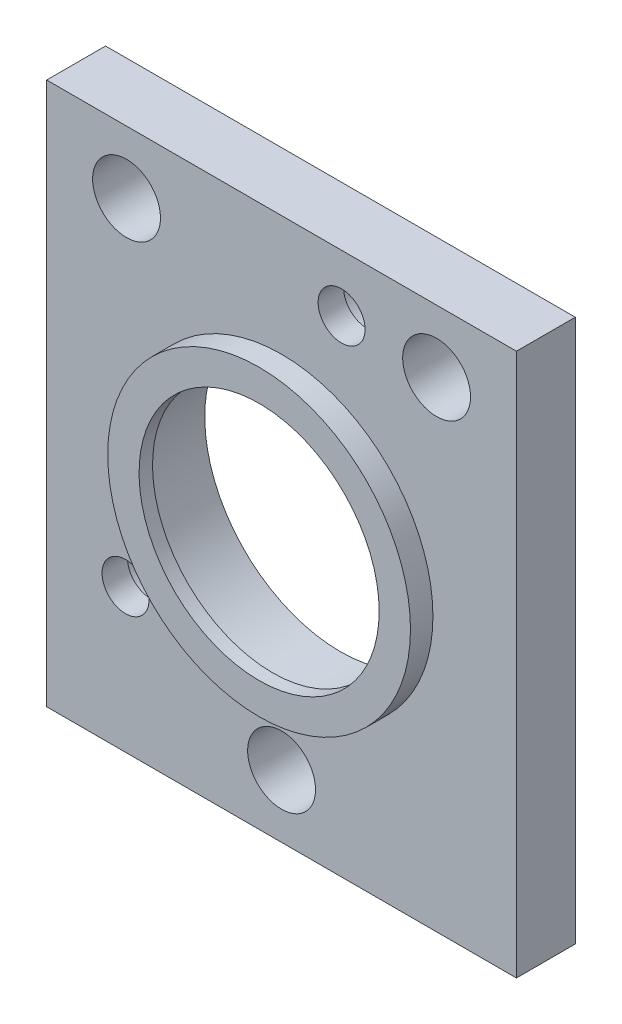
ISO-10303-21;
HEADER;
FILE_DESCRIPTION(('STEP AP214'),'2;1');
FILE_NAME('part.step','',(''),(''),'','','');
FILE_SCHEMA(('AUTOMOTIVE_DESIGN { 1 0 10303 214 1 1 1 1 }'));
ENDSEC;
DATA;
#1=APPLICATION_CONTEXT('core data for automotive mechanical design processes');
#2=APPLICATION_PROTOCOL_DEFINITION('international standard','automotive_design',2000,#1);
#3=PRODUCT_CONTEXT('',#1,'mechanical');
#4=PRODUCT('Part','Part','',(#3));
#5=PRODUCT_RELATED_PRODUCT_CATEGORY('part','',(#4));
#6=PRODUCT_DEFINITION_FORMATION('','',#4);
#7=PRODUCT_DEFINITION_CONTEXT('part definition',#1,'design');
#8=PRODUCT_DEFINITION('design','',#6,#7);
#9=PRODUCT_DEFINITION_SHAPE('','',#8);
#10=(LENGTH_UNIT() NAMED_UNIT(*) SI_UNIT(.MILLI.,.METRE.));
#11=(NAMED_UNIT(*) PLANE_ANGLE_UNIT() SI_UNIT($,.RADIAN.));
#12=(NAMED_UNIT(*) SI_UNIT($,.STERADIAN.) SOLID_ANGLE_UNIT());
#13=UNCERTAINTY_MEASURE_WITH_UNIT(LENGTH_MEASURE(1.E-05),#10,'distance_accuracy_value','');
#14=(GEOMETRIC_REPRESENTATION_CONTEXT(3) GLOBAL_UNCERTAINTY_ASSIGNED_CONTEXT((#13)) GLOBAL_UNIT_ASSIGNED_CONTEXT((#10,
#11,#12)) REPRESENTATION_CONTEXT('',''));
#15=CARTESIAN_POINT('',(0.,0.,0.));
#16=DIRECTION('',(0.,0.,1.));
#17=DIRECTION('',(1.,0.,0.));
#18=AXIS2_PLACEMENT_3D('',#15,#16,#17);
#19=CARTESIAN_POINT('',(-14.95,-12.25,3.2));
#20=DIRECTION('',(0.,0.,-1.));
#21=DIRECTION('',(0.,-1.,0.));
#22=AXIS2_PLACEMENT_3D('',#19,#20,#21);
#23=CYLINDRICAL_SURFACE('',#22,3.25);
#24=CARTESIAN_POINT('',(-14.95,-12.25,0.));
#25=DIRECTION('',(0.,0.,-1.));
#26=DIRECTION('',(0.,-1.,0.));
#27=AXIS2_PLACEMENT_3D('',#24,#25,#26);
#28=CIRCLE('',#27,3.25);
#29=CARTESIAN_POINT('',(-14.95,-15.5,0.));
#30=VERTEX_POINT('',#29);
#31=EDGE_CURVE('E11',#30,#30,#28,.T.);
#32=ORIENTED_EDGE('',*,*,#31,.T.);
#33=EDGE_LOOP('',(#32));
#34=FACE_BOUND('',#33,.T.);
#35=CARTESIAN_POINT('',(-14.95,-12.25,3.2));
#36=DIRECTION('',(0.,0.,-1.));
#37=DIRECTION('',(0.,-1.,0.));
#38=AXIS2_PLACEMENT_3D('',#35,#36,#37);
#39=CIRCLE('',#38,3.25);
#40=CARTESIAN_POINT('',(-14.95,-15.5,3.2));
#41=VERTEX_POINT('',#40);
#42=EDGE_CURVE('E98',#41,#41,#39,.T.);
#43=ORIENTED_EDGE('',*,*,#42,.F.);
#44=EDGE_LOOP('',(#43));
#45=FACE_BOUND('',#44,.T.);
#46=ADVANCED_FACE('F16',(#34,#45),#23,.F.);
#47=CARTESIAN_POINT('',(5.75,20.55,3.2));
#48=DIRECTION('',(0.,0.,-1.));
#49=DIRECTION('',(0.,-1.,0.));
#50=AXIS2_PLACEMENT_3D('',#47,#48,#49);
#51=CYLINDRICAL_SURFACE('',#50,3.25);
#52=CARTESIAN_POINT('',(5.75,20.55,0.));
#53=DIRECTION('',(0.,0.,-1.));
#54=DIRECTION('',(0.,-1.,0.));
#55=AXIS2_PLACEMENT_3D('',#52,#53,#54);
#56=CIRCLE('',#55,3.25);
#57=CARTESIAN_POINT('',(5.75,17.3,0.));
#58=VERTEX_POINT('',#57);
#59=EDGE_CURVE('E26',#58,#58,#56,.T.);
#60=ORIENTED_EDGE('',*,*,#59,.T.);
#61=EDGE_LOOP('',(#60));
#62=FACE_BOUND('',#61,.T.);
#63=CARTESIAN_POINT('',(5.75,20.55,3.2));
#64=DIRECTION('',(0.,0.,-1.));
#65=DIRECTION('',(0.,-1.,0.));
#66=AXIS2_PLACEMENT_3D('',#63,#64,#65);
#67=CIRCLE('',#66,3.25);
#68=CARTESIAN_POINT('',(5.75,17.3,3.2));
#69=VERTEX_POINT('',#68);
#70=EDGE_CURVE('E105',#69,#69,#67,.T.);
#71=ORIENTED_EDGE('',*,*,#70,.F.);
#72=EDGE_LOOP('',(#71));
#73=FACE_BOUND('',#72,.T.);
#74=ADVANCED_FACE('F152',(#62,#73),#51,.F.);
#75=CARTESIAN_POINT('',(14.85,20.,0.));
#76=DIRECTION('',(0.,0.,-1.));
#77=DIRECTION('',(0.,-1.,0.));
#78=AXIS2_PLACEMENT_3D('',#75,#76,#77);
#79=CYLINDRICAL_SURFACE('',#78,3.25);
#80=CARTESIAN_POINT('',(14.85,20.,0.));
#81=DIRECTION('',(0.,0.,-1.));
#82=DIRECTION('',(0.,-1.,0.));
#83=AXIS2_PLACEMENT_3D('',#80,#81,#82);
#84=CIRCLE('',#83,3.25);
#85=CARTESIAN_POINT('',(14.85,16.75,0.));
#86=VERTEX_POINT('',#85);
#87=EDGE_CURVE('E138',#86,#86,#84,.T.);
#88=ORIENTED_EDGE('',*,*,#87,.T.);
#89=EDGE_LOOP('',(#88));
#90=FACE_BOUND('',#89,.T.);
#91=CARTESIAN_POINT('',(14.85,20.,5.64));
#92=DIRECTION('',(0.,0.,1.));
#93=DIRECTION('',(1.,0.,0.));
#94=AXIS2_PLACEMENT_3D('',#91,#92,#93);
#95=CIRCLE('',#94,3.25);
#96=CARTESIAN_POINT('',(18.1,20.,5.64));
#97=VERTEX_POINT('',#96);
#98=EDGE_CURVE('E135',#97,#97,#95,.T.);
#99=ORIENTED_EDGE('',*,*,#98,.T.);
#100=EDGE_LOOP('',(#99));
#101=FACE_BOUND('',#100,.T.);
#102=ADVANCED_FACE('F159',(#90,#101),#79,.F.);
#103=CARTESIAN_POINT('',(-14.85,20.,0.));
#104=DIRECTION('',(0.,0.,-1.));
#105=DIRECTION('',(0.,-1.,0.));
#106=AXIS2_PLACEMENT_3D('',#103,#104,#105);
#107=CYLINDRICAL_SURFACE('',#106,3.25);
#108=CARTESIAN_POINT('',(-14.85,20.,0.));
#109=DIRECTION('',(0.,0.,-1.));
#110=DIRECTION('',(0.,-1.,0.));
#111=AXIS2_PLACEMENT_3D('',#108,#109,#110);
#112=CIRCLE('',#111,3.25);
#113=CARTESIAN_POINT('',(-14.85,16.75,0.));
#114=VERTEX_POINT('',#113);
#115=EDGE_CURVE('E132',#114,#114,#112,.T.);
#116=ORIENTED_EDGE('',*,*,#115,.T.);
#117=EDGE_LOOP('',(#116));
#118=FACE_BOUND('',#117,.T.);
#119=CARTESIAN_POINT('',(-14.85,20.,5.64));
#120=DIRECTION('',(0.,0.,1.));
#121=DIRECTION('',(1.,0.,0.));
#122=AXIS2_PLACEMENT_3D('',#119,#120,#121);
#123=CIRCLE('',#122,3.25);
#124=CARTESIAN_POINT('',(-11.6,20.,5.64));
#125=VERTEX_POINT('',#124);
#126=EDGE_CURVE('E129',#125,#125,#123,.T.);
#127=ORIENTED_EDGE('',*,*,#126,.T.);
#128=EDGE_LOOP('',(#127));
#129=FACE_BOUND('',#128,.T.);
#130=ADVANCED_FACE('F171',(#118,#129),#107,.F.);
#131=CARTESIAN_POINT('',(0.,-20.,0.));
#132=DIRECTION('',(0.,0.,-1.));
#133=DIRECTION('',(0.,-1.,0.));
#134=AXIS2_PLACEMENT_3D('',#131,#132,#133);
#135=CYLINDRICAL_SURFACE('',#134,3.25);
#136=CARTESIAN_POINT('',(0.,-20.,0.));
#137=DIRECTION('',(0.,0.,-1.));
#138=DIRECTION('',(0.,-1.,0.));
#139=AXIS2_PLACEMENT_3D('',#136,#137,#138);
#140=CIRCLE('',#139,3.25);
#141=CARTESIAN_POINT('',(0.,-23.25,0.));
#142=VERTEX_POINT('',#141);
#143=EDGE_CURVE('E126',#142,#142,#140,.T.);
#144=ORIENTED_EDGE('',*,*,#143,.T.);
#145=EDGE_LOOP('',(#144));
#146=FACE_BOUND('',#145,.T.);
#147=CARTESIAN_POINT('',(0.,-20.,5.64));
#148=DIRECTION('',(0.,0.,1.));
#149=DIRECTION('',(1.,0.,0.));
#150=AXIS2_PLACEMENT_3D('',#147,#148,#149);
#151=CIRCLE('',#150,3.25);
#152=CARTESIAN_POINT('',(3.25,-20.,5.64));
#153=VERTEX_POINT('',#152);
#154=EDGE_CURVE('E123',#153,#153,#151,.T.);
#155=ORIENTED_EDGE('',*,*,#154,.T.);
#156=EDGE_LOOP('',(#155));
#157=FACE_BOUND('',#156,.T.);
#158=ADVANCED_FACE('F18',(#146,#157),#135,.F.);
#159=CARTESIAN_POINT('',(0.,0.,6.5));
#160=DIRECTION('',(0.,0.,-1.));
#161=DIRECTION('',(0.,-1.,0.));
#162=AXIS2_PLACEMENT_3D('',#159,#160,#161);
#163=CYLINDRICAL_SURFACE('',#162,13.);
#164=CARTESIAN_POINT('',(0.,0.,0.));
#165=DIRECTION('',(0.,0.,-1.));
#166=DIRECTION('',(0.,-1.,0.));
#167=AXIS2_PLACEMENT_3D('',#164,#165,#166);
#168=CIRCLE('',#167,13.);
#169=CARTESIAN_POINT('',(0.,-13.,0.));
#170=VERTEX_POINT('',#169);
#171=EDGE_CURVE('E114',#170,#170,#168,.T.);
#172=ORIENTED_EDGE('',*,*,#171,.T.);
#173=EDGE_LOOP('',(#172));
#174=FACE_BOUND('',#173,.T.);
#175=CARTESIAN_POINT('',(0.,0.,6.5));
#176=DIRECTION('',(0.,0.,-1.));
#177=DIRECTION('',(0.,-1.,0.));
#178=AXIS2_PLACEMENT_3D('',#175,#176,#177);
#179=CIRCLE('',#178,13.);
#180=CARTESIAN_POINT('',(0.,-13.,6.5));
#181=VERTEX_POINT('',#180);
#182=EDGE_CURVE('E118',#181,#181,#179,.T.);
#183=ORIENTED_EDGE('',*,*,#182,.F.);
#184=EDGE_LOOP('',(#183));
#185=FACE_BOUND('',#184,.T.);
#186=ADVANCED_FACE('F169',(#174,#185),#163,.F.);
#187=CARTESIAN_POINT('',(0.,0.,7.79));
#188=DIRECTION('',(0.,0.,-1.));
#189=DIRECTION('',(0.,-1.,0.));
#190=AXIS2_PLACEMENT_3D('',#187,#188,#189);
#191=CYLINDRICAL_SURFACE('',#190,14.5);
#192=CARTESIAN_POINT('',(0.,0.,7.79));
#193=DIRECTION('',(0.,0.,1.));
#194=DIRECTION('',(1.,0.,0.));
#195=AXIS2_PLACEMENT_3D('',#192,#193,#194);
#196=CIRCLE('',#195,14.5);
#197=CARTESIAN_POINT('',(14.5,0.,7.79));
#198=VERTEX_POINT('',#197);
#199=EDGE_CURVE('E115',#198,#198,#196,.T.);
#200=ORIENTED_EDGE('',*,*,#199,.F.);
#201=EDGE_LOOP('',(#200));
#202=FACE_BOUND('',#201,.T.);
#203=CARTESIAN_POINT('',(0.,0.,5.64));
#204=DIRECTION('',(0.,0.,1.));
#205=DIRECTION('',(1.,0.,0.));
#206=AXIS2_PLACEMENT_3D('',#203,#204,#205);
#207=CIRCLE('',#206,14.5);
#208=CARTESIAN_POINT('',(14.5,0.,5.64));
#209=VERTEX_POINT('',#208);
#210=EDGE_CURVE('E111',#209,#209,#207,.T.);
#211=ORIENTED_EDGE('',*,*,#210,.T.);
#212=EDGE_LOOP('',(#211));
#213=FACE_BOUND('',#212,.T.);
#214=ADVANCED_FACE('F165',(#202,#213),#191,.T.);
#215=CARTESIAN_POINT('',(0.,0.,5.64));
#216=DIRECTION('',(0.,0.,-1.));
#217=DIRECTION('',(0.,-1.,0.));
#218=AXIS2_PLACEMENT_3D('',#215,#216,#217);
#219=CYLINDRICAL_SURFACE('',#218,11.5);
#220=CARTESIAN_POINT('',(0.,0.,6.5));
#221=DIRECTION('',(0.,0.,-1.));
#222=DIRECTION('',(0.,-1.,0.));
#223=AXIS2_PLACEMENT_3D('',#220,#221,#222);
#224=CIRCLE('',#223,11.5);
#225=CARTESIAN_POINT('',(0.,-11.5,6.5));
#226=VERTEX_POINT('',#225);
#227=EDGE_CURVE('E108',#226,#226,#224,.T.);
#228=ORIENTED_EDGE('',*,*,#227,.T.);
#229=EDGE_LOOP('',(#228));
#230=FACE_BOUND('',#229,.T.);
#231=CARTESIAN_POINT('',(0.,0.,7.79));
#232=DIRECTION('',(0.,0.,1.));
#233=DIRECTION('',(1.,0.,0.));
#234=AXIS2_PLACEMENT_3D('',#231,#232,#233);
#235=CIRCLE('',#234,11.5);
#236=CARTESIAN_POINT('',(11.5,0.,7.79));
#237=VERTEX_POINT('',#236);
#238=EDGE_CURVE('E101',#237,#237,#235,.T.);
#239=ORIENTED_EDGE('',*,*,#238,.T.);
#240=EDGE_LOOP('',(#239));
#241=FACE_BOUND('',#240,.T.);
#242=ADVANCED_FACE('F168',(#230,#241),#219,.F.);
#243=CARTESIAN_POINT('',(5.75,20.55,7.79));
#244=DIRECTION('',(0.,0.,-1.));
#245=DIRECTION('',(0.,-1.,0.));
#246=AXIS2_PLACEMENT_3D('',#243,#244,#245);
#247=CYLINDRICAL_SURFACE('',#246,2.25);
#248=CARTESIAN_POINT('',(5.75,20.55,3.2));
#249=DIRECTION('',(0.,0.,1.));
#250=DIRECTION('',(1.,0.,0.));
#251=AXIS2_PLACEMENT_3D('',#248,#249,#250);
#252=CIRCLE('',#251,2.25);
#253=CARTESIAN_POINT('',(8.,20.55,3.2));
#254=VERTEX_POINT('',#253);
#255=EDGE_CURVE('E102',#254,#254,#252,.T.);
#256=ORIENTED_EDGE('',*,*,#255,.F.);
#257=EDGE_LOOP('',(#256));
#258=FACE_BOUND('',#257,.T.);
#259=CARTESIAN_POINT('',(5.75,20.55,5.64));
#260=DIRECTION('',(0.,0.,1.));
#261=DIRECTION('',(1.,0.,0.));
#262=AXIS2_PLACEMENT_3D('',#259,#260,#261);
#263=CIRCLE('',#262,2.25);
#264=CARTESIAN_POINT('',(8.,20.55,5.64));
#265=VERTEX_POINT('',#264);
#266=EDGE_CURVE('E94',#265,#265,#263,.T.);
#267=ORIENTED_EDGE('',*,*,#266,.T.);
#268=EDGE_LOOP('',(#267));
#269=FACE_BOUND('',#268,.T.);
#270=ADVANCED_FACE('F180',(#258,#269),#247,.F.);
#271=CARTESIAN_POINT('',(-14.95,-12.25,7.79));
#272=DIRECTION('',(0.,0.,-1.));
#273=DIRECTION('',(0.,-1.,0.));
#274=AXIS2_PLACEMENT_3D('',#271,#272,#273);
#275=CYLINDRICAL_SURFACE('',#274,2.25);
#276=CARTESIAN_POINT('',(-14.95,-12.25,3.2));
#277=DIRECTION('',(0.,0.,1.));
#278=DIRECTION('',(1.,0.,0.));
#279=AXIS2_PLACEMENT_3D('',#276,#277,#278);
#280=CIRCLE('',#279,2.25);
#281=CARTESIAN_POINT('',(-12.7,-12.25,3.2));
#282=VERTEX_POINT('',#281);
#283=EDGE_CURVE('E95',#282,#282,#280,.T.);
#284=ORIENTED_EDGE('',*,*,#283,.F.);
#285=EDGE_LOOP('',(#284));
#286=FACE_BOUND('',#285,.T.);
#287=CARTESIAN_POINT('',(-14.95,-12.25,5.64));
#288=DIRECTION('',(0.,0.,1.));
#289=DIRECTION('',(1.,0.,0.));
#290=AXIS2_PLACEMENT_3D('',#287,#288,#289);
#291=CIRCLE('',#290,2.25);
#292=CARTESIAN_POINT('',(-12.7,-12.25,5.64));
#293=VERTEX_POINT('',#292);
#294=EDGE_CURVE('E91',#293,#293,#291,.T.);
#295=ORIENTED_EDGE('',*,*,#294,.T.);
#296=EDGE_LOOP('',(#295));
#297=FACE_BOUND('',#296,.T.);
#298=ADVANCED_FACE('F182',(#286,#297),#275,.F.);
#299=CARTESIAN_POINT('',(0.,0.,5.64));
#300=DIRECTION('',(0.,0.,1.));
#301=DIRECTION('',(1.,0.,0.));
#302=AXIS2_PLACEMENT_3D('',#299,#300,#301);
#303=PLANE('',#302);
#304=DIRECTION('',(0.,-1.,0.));
#305=VECTOR('',#304,1.);
#306=CARTESIAN_POINT('',(-22.5,-26.,5.64));
#307=LINE('',#306,#305);
#308=CARTESIAN_POINT('',(-22.5,26.,5.64));
#309=VERTEX_POINT('',#308);
#310=CARTESIAN_POINT('',(-22.5,-26.,5.64));
#311=VERTEX_POINT('',#310);
#312=EDGE_CURVE('E89',#309,#311,#307,.T.);
#313=ORIENTED_EDGE('',*,*,#312,.T.);
#314=DIRECTION('',(1.,0.,0.));
#315=VECTOR('',#314,1.);
#316=CARTESIAN_POINT('',(22.5,-26.,5.64));
#317=LINE('',#316,#315);
#318=CARTESIAN_POINT('',(22.5,-26.,5.64));
#319=VERTEX_POINT('',#318);
#320=EDGE_CURVE('E35',#311,#319,#317,.T.);
#321=ORIENTED_EDGE('',*,*,#320,.T.);
#322=DIRECTION('',(0.,1.,0.));
#323=VECTOR('',#322,1.);
#324=CARTESIAN_POINT('',(22.5,-26.,5.64));
#325=LINE('',#324,#323);
#326=CARTESIAN_POINT('',(22.5,26.,5.64));
#327=VERTEX_POINT('',#326);
#328=EDGE_CURVE('E76',#319,#327,#325,.T.);
#329=ORIENTED_EDGE('',*,*,#328,.T.);
#330=DIRECTION('',(-1.,0.,0.));
#331=VECTOR('',#330,1.);
#332=CARTESIAN_POINT('',(22.5,26.,5.64));
#333=LINE('',#332,#331);
#334=EDGE_CURVE('E84',#327,#309,#333,.T.);
#335=ORIENTED_EDGE('',*,*,#334,.T.);
#336=EDGE_LOOP('',(#313,#321,#329,#335));
#337=FACE_BOUND('',#336,.T.);
#338=ORIENTED_EDGE('',*,*,#210,.F.);
#339=EDGE_LOOP('',(#338));
#340=FACE_BOUND('',#339,.T.);
#341=ORIENTED_EDGE('',*,*,#294,.F.);
#342=EDGE_LOOP('',(#341));
#343=FACE_BOUND('',#342,.T.);
#344=ORIENTED_EDGE('',*,*,#266,.F.);
#345=EDGE_LOOP('',(#344));
#346=FACE_BOUND('',#345,.T.);
#347=ORIENTED_EDGE('',*,*,#98,.F.);
#348=EDGE_LOOP('',(#347));
#349=FACE_BOUND('',#348,.T.);
#350=ORIENTED_EDGE('',*,*,#126,.F.);
#351=EDGE_LOOP('',(#350));
#352=FACE_BOUND('',#351,.T.);
#353=ORIENTED_EDGE('',*,*,#154,.F.);
#354=EDGE_LOOP('',(#353));
#355=FACE_BOUND('',#354,.T.);
#356=ADVANCED_FACE('F185',(#337,#340,#343,#346,#349,#352,#355),#303,.T.);
#357=CARTESIAN_POINT('',(0.,0.,0.));
#358=DIRECTION('',(0.,0.,1.));
#359=DIRECTION('',(1.,0.,0.));
#360=AXIS2_PLACEMENT_3D('',#357,#358,#359);
#361=PLANE('',#360);
#362=DIRECTION('',(0.,-1.,0.));
#363=VECTOR('',#362,1.);
#364=CARTESIAN_POINT('',(-22.5,-26.,0.));
#365=LINE('',#364,#363);
#366=CARTESIAN_POINT('',(-22.5,26.,0.));
#367=VERTEX_POINT('',#366);
#368=CARTESIAN_POINT('',(-22.5,-26.,0.));
#369=VERTEX_POINT('',#368);
#370=EDGE_CURVE('E81',#367,#369,#365,.T.);
#371=ORIENTED_EDGE('',*,*,#370,.F.);
#372=DIRECTION('',(-1.,0.,0.));
#373=VECTOR('',#372,1.);
#374=CARTESIAN_POINT('',(22.5,26.,0.));
#375=LINE('',#374,#373);
#376=CARTESIAN_POINT('',(22.5,26.,0.));
#377=VERTEX_POINT('',#376);
#378=EDGE_CURVE('E55',#377,#367,#375,.T.);
#379=ORIENTED_EDGE('',*,*,#378,.F.);
#380=DIRECTION('',(0.,1.,0.));
#381=VECTOR('',#380,1.);
#382=CARTESIAN_POINT('',(22.5,-26.,0.));
#383=LINE('',#382,#381);
#384=CARTESIAN_POINT('',(22.5,-26.,0.));
#385=VERTEX_POINT('',#384);
#386=EDGE_CURVE('E57',#385,#377,#383,.T.);
#387=ORIENTED_EDGE('',*,*,#386,.F.);
#388=DIRECTION('',(1.,0.,0.));
#389=VECTOR('',#388,1.);
#390=CARTESIAN_POINT('',(22.5,-26.,0.));
#391=LINE('',#390,#389);
#392=EDGE_CURVE('E61',#369,#385,#391,.T.);
#393=ORIENTED_EDGE('',*,*,#392,.F.);
#394=EDGE_LOOP('',(#371,#379,#387,#393));
#395=FACE_BOUND('',#394,.T.);
#396=ORIENTED_EDGE('',*,*,#31,.F.);
#397=EDGE_LOOP('',(#396));
#398=FACE_BOUND('',#397,.T.);
#399=ORIENTED_EDGE('',*,*,#59,.F.);
#400=EDGE_LOOP('',(#399));
#401=FACE_BOUND('',#400,.T.);
#402=ORIENTED_EDGE('',*,*,#87,.F.);
#403=EDGE_LOOP('',(#402));
#404=FACE_BOUND('',#403,.T.);
#405=ORIENTED_EDGE('',*,*,#115,.F.);
#406=EDGE_LOOP('',(#405));
#407=FACE_BOUND('',#406,.T.);
#408=ORIENTED_EDGE('',*,*,#143,.F.);
#409=EDGE_LOOP('',(#408));
#410=FACE_BOUND('',#409,.T.);
#411=ORIENTED_EDGE('',*,*,#171,.F.);
#412=EDGE_LOOP('',(#411));
#413=FACE_BOUND('',#412,.T.);
#414=ADVANCED_FACE('F59',(#395,#398,#401,#404,#407,#410,#413),#361,.F.);
#415=CARTESIAN_POINT('',(-22.5,-26.,5.64));
#416=DIRECTION('',(1.,0.,0.));
#417=DIRECTION('',(0.,0.,-1.));
#418=AXIS2_PLACEMENT_3D('',#415,#416,#417);
#419=PLANE('',#418);
#420=ORIENTED_EDGE('',*,*,#370,.T.);
#421=DIRECTION('',(0.,0.,-1.));
#422=VECTOR('',#421,1.);
#423=CARTESIAN_POINT('',(-22.5,-26.,5.64));
#424=LINE('',#423,#422);
#425=EDGE_CURVE('E67',#311,#369,#424,.T.);
#426=ORIENTED_EDGE('',*,*,#425,.F.);
#427=ORIENTED_EDGE('',*,*,#312,.F.);
#428=DIRECTION('',(0.,0.,-1.));
#429=VECTOR('',#428,1.);
#430=CARTESIAN_POINT('',(-22.5,26.,5.64));
#431=LINE('',#430,#429);
#432=EDGE_CURVE('E72',#309,#367,#431,.T.);
#433=ORIENTED_EDGE('',*,*,#432,.T.);
#434=EDGE_LOOP('',(#420,#426,#427,#433));
#435=FACE_BOUND('',#434,.T.);
#436=ADVANCED_FACE('F245',(#435),#419,.F.);
#437=CARTESIAN_POINT('',(22.5,-26.,5.64));
#438=DIRECTION('',(0.,1.,0.));
#439=DIRECTION('',(-1.,0.,0.));
#440=AXIS2_PLACEMENT_3D('',#437,#438,#439);
#441=PLANE('',#440);
#442=ORIENTED_EDGE('',*,*,#392,.T.);
#443=DIRECTION('',(0.,0.,-1.));
#444=VECTOR('',#443,1.);
#445=CARTESIAN_POINT('',(22.5,-26.,5.64));
#446=LINE('',#445,#444);
#447=EDGE_CURVE('E68',#319,#385,#446,.T.);
#448=ORIENTED_EDGE('',*,*,#447,.F.);
#449=ORIENTED_EDGE('',*,*,#320,.F.);
#450=ORIENTED_EDGE('',*,*,#425,.T.);
#451=EDGE_LOOP('',(#442,#448,#449,#450));
#452=FACE_BOUND('',#451,.T.);
#453=ADVANCED_FACE('F70',(#452),#441,.F.);
#454=CARTESIAN_POINT('',(22.5,-26.,5.64));
#455=DIRECTION('',(-1.,0.,0.));
#456=DIRECTION('',(0.,0.,1.));
#457=AXIS2_PLACEMENT_3D('',#454,#455,#456);
#458=PLANE('',#457);
#459=ORIENTED_EDGE('',*,*,#386,.T.);
#460=DIRECTION('',(0.,0.,-1.));
#461=VECTOR('',#460,1.);
#462=CARTESIAN_POINT('',(22.5,26.,5.64));
#463=LINE('',#462,#461);
#464=EDGE_CURVE('E20',#327,#377,#463,.T.);
#465=ORIENTED_EDGE('',*,*,#464,.F.);
#466=ORIENTED_EDGE('',*,*,#328,.F.);
#467=ORIENTED_EDGE('',*,*,#447,.T.);
#468=EDGE_LOOP('',(#459,#465,#466,#467));
#469=FACE_BOUND('',#468,.T.);
#470=ADVANCED_FACE('F74',(#469),#458,.F.);
#471=CARTESIAN_POINT('',(22.5,26.,5.64));
#472=DIRECTION('',(0.,-1.,0.));
#473=DIRECTION('',(1.,0.,0.));
#474=AXIS2_PLACEMENT_3D('',#471,#472,#473);
#475=PLANE('',#474);
#476=ORIENTED_EDGE('',*,*,#378,.T.);
#477=ORIENTED_EDGE('',*,*,#432,.F.);
#478=ORIENTED_EDGE('',*,*,#334,.F.);
#479=ORIENTED_EDGE('',*,*,#464,.T.);
#480=EDGE_LOOP('',(#476,#477,#478,#479));
#481=FACE_BOUND('',#480,.T.);
#482=ADVANCED_FACE('F210',(#481),#475,.F.);
#483=CARTESIAN_POINT('',(0.,0.,7.79));
#484=DIRECTION('',(0.,0.,1.));
#485=DIRECTION('',(1.,0.,0.));
#486=AXIS2_PLACEMENT_3D('',#483,#484,#485);
#487=PLANE('',#486);
#488=ORIENTED_EDGE('',*,*,#199,.T.);
#489=EDGE_LOOP('',(#488));
#490=FACE_BOUND('',#489,.T.);
#491=ORIENTED_EDGE('',*,*,#238,.F.);
#492=EDGE_LOOP('',(#491));
#493=FACE_BOUND('',#492,.T.);
#494=ADVANCED_FACE('F203',(#490,#493),#487,.T.);
#495=CARTESIAN_POINT('',(0.,0.,6.5));
#496=DIRECTION('',(0.,0.,-1.));
#497=DIRECTION('',(-1.,0.,0.));
#498=AXIS2_PLACEMENT_3D('',#495,#496,#497);
#499=PLANE('',#498);
#500=ORIENTED_EDGE('',*,*,#182,.T.);
#501=EDGE_LOOP('',(#500));
#502=FACE_BOUND('',#501,.T.);
#503=ORIENTED_EDGE('',*,*,#227,.F.);
#504=EDGE_LOOP('',(#503));
#505=FACE_BOUND('',#504,.T.);
#506=ADVANCED_FACE('F199',(#502,#505),#499,.T.);
#507=CARTESIAN_POINT('',(5.75,20.55,3.2));
#508=DIRECTION('',(0.,0.,-1.));
#509=DIRECTION('',(-1.,0.,0.));
#510=AXIS2_PLACEMENT_3D('',#507,#508,#509);
#511=PLANE('',#510);
#512=ORIENTED_EDGE('',*,*,#70,.T.);
#513=EDGE_LOOP('',(#512));
#514=FACE_BOUND('',#513,.T.);
#515=ORIENTED_EDGE('',*,*,#255,.T.);
#516=EDGE_LOOP('',(#515));
#517=FACE_BOUND('',#516,.T.);
#518=ADVANCED_FACE('F202',(#514,#517),#511,.T.);
#519=CARTESIAN_POINT('',(-14.95,-12.25,3.2));
#520=DIRECTION('',(0.,0.,-1.));
#521=DIRECTION('',(-1.,0.,0.));
#522=AXIS2_PLACEMENT_3D('',#519,#520,#521);
#523=PLANE('',#522);
#524=ORIENTED_EDGE('',*,*,#42,.T.);
#525=EDGE_LOOP('',(#524));
#526=FACE_BOUND('',#525,.T.);
#527=ORIENTED_EDGE('',*,*,#283,.T.);
#528=EDGE_LOOP('',(#527));
#529=FACE_BOUND('',#528,.T.);
#530=ADVANCED_FACE('F148',(#526,#529),#523,.T.);
#531=CLOSED_SHELL('',(#46,#74,#102,#130,#158,#186,#214,#242,#270,#298,#356,#414,#436,#453,#470,
#482,#494,#506,#518,#530));
#532=MANIFOLD_SOLID_BREP('B1',#531);
#533=ADVANCED_BREP_SHAPE_REPRESENTATION('',(#18,#532),#14);
#534=SHAPE_DEFINITION_REPRESENTATION(#9,#533);
ENDSEC;
END-ISO-10303-21;
